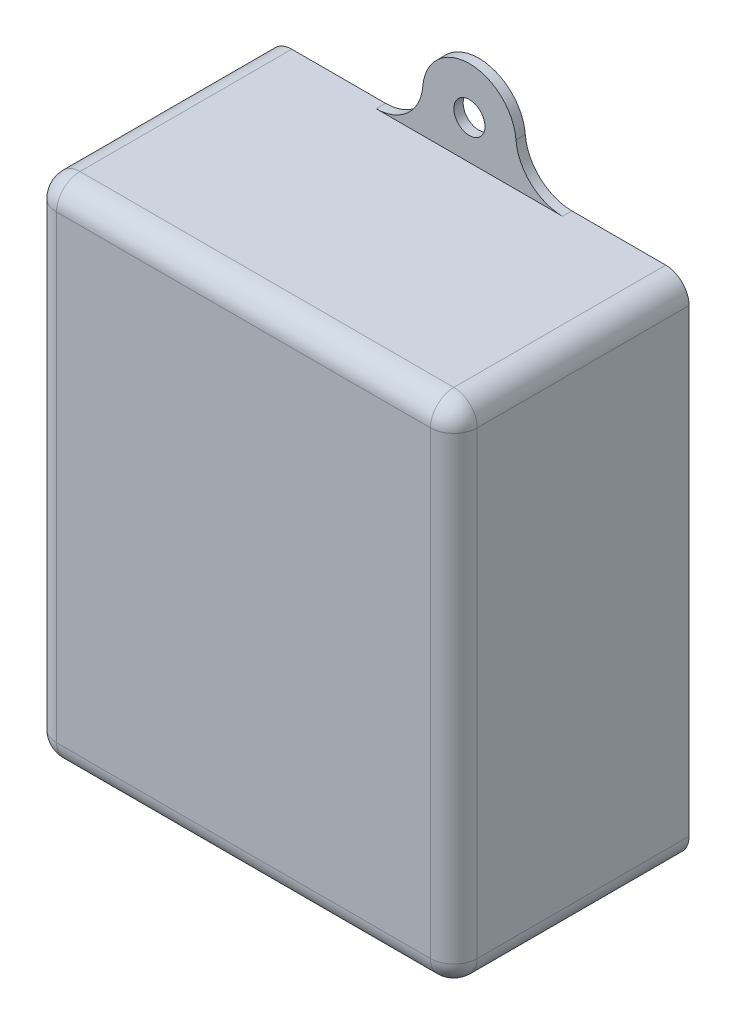
ISO-10303-21;
HEADER;
FILE_DESCRIPTION(('STEP AP214'),'2;1');
FILE_NAME('part.step','',(''),(''),'','','');
FILE_SCHEMA(('AUTOMOTIVE_DESIGN { 1 0 10303 214 1 1 1 1 }'));
ENDSEC;
DATA;
#1=APPLICATION_CONTEXT('core data for automotive mechanical design processes');
#2=APPLICATION_PROTOCOL_DEFINITION('international standard','automotive_design',2000,#1);
#3=PRODUCT_CONTEXT('',#1,'mechanical');
#4=PRODUCT('Part','Part','',(#3));
#5=PRODUCT_RELATED_PRODUCT_CATEGORY('part','',(#4));
#6=PRODUCT_DEFINITION_FORMATION('','',#4);
#7=PRODUCT_DEFINITION_CONTEXT('part definition',#1,'design');
#8=PRODUCT_DEFINITION('design','',#6,#7);
#9=PRODUCT_DEFINITION_SHAPE('','',#8);
#10=(LENGTH_UNIT() NAMED_UNIT(*) SI_UNIT(.MILLI.,.METRE.));
#11=(NAMED_UNIT(*) PLANE_ANGLE_UNIT() SI_UNIT($,.RADIAN.));
#12=(NAMED_UNIT(*) SI_UNIT($,.STERADIAN.) SOLID_ANGLE_UNIT());
#13=UNCERTAINTY_MEASURE_WITH_UNIT(LENGTH_MEASURE(1.E-05),#10,'distance_accuracy_value','');
#14=(GEOMETRIC_REPRESENTATION_CONTEXT(3) GLOBAL_UNCERTAINTY_ASSIGNED_CONTEXT((#13)) GLOBAL_UNIT_ASSIGNED_CONTEXT((#10,
#11,#12)) REPRESENTATION_CONTEXT('',''));
#15=CARTESIAN_POINT('',(0.,0.,0.));
#16=DIRECTION('',(0.,0.,1.));
#17=DIRECTION('',(1.,0.,0.));
#18=AXIS2_PLACEMENT_3D('',#15,#16,#17);
#19=CARTESIAN_POINT('',(-11.9582607431014,38.5,1.2));
#20=DIRECTION('',(0.,0.,-1.));
#21=DIRECTION('',(-1.,0.,0.));
#22=AXIS2_PLACEMENT_3D('',#19,#20,#21);
#23=PLANE('',#22);
#24=CARTESIAN_POINT('',(0.,37.5,1.2));
#25=DIRECTION('',(0.,0.,1.));
#26=DIRECTION('',(1.,0.,0.));
#27=AXIS2_PLACEMENT_3D('',#24,#25,#26);
#28=CIRCLE('',#27,2.);
#29=CARTESIAN_POINT('',(2.00000000000001,37.5,1.2));
#30=VERTEX_POINT('',#29);
#31=EDGE_CURVE('E180',#30,#30,#28,.T.);
#32=ORIENTED_EDGE('',*,*,#31,.F.);
#33=EDGE_LOOP('',(#32));
#34=FACE_BOUND('',#33,.T.);
#35=DIRECTION('',(-1.,0.,0.));
#36=VECTOR('',#35,1.);
#37=CARTESIAN_POINT('',(-27.,32.5,1.2));
#38=LINE('',#37,#36);
#39=CARTESIAN_POINT('',(11.9582607431014,32.5,1.2));
#40=VERTEX_POINT('',#39);
#41=CARTESIAN_POINT('',(-11.9582607431014,32.5,1.2));
#42=VERTEX_POINT('',#41);
#43=EDGE_CURVE('E171',#40,#42,#38,.T.);
#44=ORIENTED_EDGE('',*,*,#43,.F.);
#45=CARTESIAN_POINT('',(11.9582607431014,38.5,1.2));
#46=DIRECTION('',(0.,0.,-1.));
#47=DIRECTION('',(1.,0.,0.));
#48=AXIS2_PLACEMENT_3D('',#45,#46,#47);
#49=CIRCLE('',#48,5.99999999999999);
#50=CARTESIAN_POINT('',(5.97913037155071,38.,1.2));
#51=VERTEX_POINT('',#50);
#52=EDGE_CURVE('E215',#40,#51,#49,.T.);
#53=ORIENTED_EDGE('',*,*,#52,.T.);
#54=CARTESIAN_POINT('',(0.,37.5,1.2));
#55=DIRECTION('',(0.,0.,1.));
#56=DIRECTION('',(1.,0.,0.));
#57=AXIS2_PLACEMENT_3D('',#54,#55,#56);
#58=CIRCLE('',#57,6.00000000000001);
#59=CARTESIAN_POINT('',(-5.9791303715507,38.,1.2));
#60=VERTEX_POINT('',#59);
#61=EDGE_CURVE('E213',#51,#60,#58,.T.);
#62=ORIENTED_EDGE('',*,*,#61,.T.);
#63=CARTESIAN_POINT('',(-11.9582607431014,38.5,1.2));
#64=DIRECTION('',(0.,0.,-1.));
#65=DIRECTION('',(-1.,0.,0.));
#66=AXIS2_PLACEMENT_3D('',#63,#64,#65);
#67=CIRCLE('',#66,5.99999999999999);
#68=EDGE_CURVE('E208',#60,#42,#67,.T.);
#69=ORIENTED_EDGE('',*,*,#68,.T.);
#70=EDGE_LOOP('',(#44,#53,#62,#69));
#71=FACE_BOUND('',#70,.T.);
#72=ADVANCED_FACE('F29',(#34,#71),#23,.F.);
#73=CARTESIAN_POINT('',(0.,-37.5,1.2));
#74=DIRECTION('',(0.,0.,1.));
#75=DIRECTION('',(-1.,0.,0.));
#76=AXIS2_PLACEMENT_3D('',#73,#74,#75);
#77=CIRCLE('',#76,2.);
#78=CARTESIAN_POINT('',(-2.,-37.5,1.2));
#79=VERTEX_POINT('',#78);
#80=EDGE_CURVE('E343',#79,#79,#77,.T.);
#81=ORIENTED_EDGE('',*,*,#80,.F.);
#82=EDGE_LOOP('',(#81));
#83=FACE_BOUND('',#82,.T.);
#84=DIRECTION('',(1.,0.,0.));
#85=VECTOR('',#84,1.);
#86=CARTESIAN_POINT('',(-27.,-32.5,1.2));
#87=LINE('',#86,#85);
#88=CARTESIAN_POINT('',(-11.9582607431014,-32.5,1.2));
#89=VERTEX_POINT('',#88);
#90=CARTESIAN_POINT('',(11.9582607431014,-32.5,1.2));
#91=VERTEX_POINT('',#90);
#92=EDGE_CURVE('E174',#89,#91,#87,.T.);
#93=ORIENTED_EDGE('',*,*,#92,.F.);
#94=CARTESIAN_POINT('',(-11.9582607431014,-38.5,1.2));
#95=DIRECTION('',(0.,0.,-1.));
#96=DIRECTION('',(1.,0.,0.));
#97=AXIS2_PLACEMENT_3D('',#94,#95,#96);
#98=CIRCLE('',#97,5.99999999999999);
#99=CARTESIAN_POINT('',(-5.97913037155069,-38.,1.2));
#100=VERTEX_POINT('',#99);
#101=EDGE_CURVE('E212',#89,#100,#98,.T.);
#102=ORIENTED_EDGE('',*,*,#101,.T.);
#103=CARTESIAN_POINT('',(0.,-37.5,1.2));
#104=DIRECTION('',(0.,0.,1.));
#105=DIRECTION('',(-1.,0.,0.));
#106=AXIS2_PLACEMENT_3D('',#103,#104,#105);
#107=CIRCLE('',#106,6.);
#108=CARTESIAN_POINT('',(5.97913037155071,-38.,1.2));
#109=VERTEX_POINT('',#108);
#110=EDGE_CURVE('E209',#100,#109,#107,.T.);
#111=ORIENTED_EDGE('',*,*,#110,.T.);
#112=CARTESIAN_POINT('',(11.9582607431014,-38.5,1.2));
#113=DIRECTION('',(0.,0.,-1.));
#114=DIRECTION('',(-1.,0.,0.));
#115=AXIS2_PLACEMENT_3D('',#112,#113,#114);
#116=CIRCLE('',#115,5.99999999999999);
#117=EDGE_CURVE('E211',#109,#91,#116,.T.);
#118=ORIENTED_EDGE('',*,*,#117,.T.);
#119=EDGE_LOOP('',(#93,#102,#111,#118));
#120=FACE_BOUND('',#119,.T.);
#121=ADVANCED_FACE('F367',(#83,#120),#23,.F.);
#122=CARTESIAN_POINT('',(-11.9582607431014,38.5,0.));
#123=DIRECTION('',(0.,0.,-1.));
#124=DIRECTION('',(-1.,0.,0.));
#125=AXIS2_PLACEMENT_3D('',#122,#123,#124);
#126=PLANE('',#125);
#127=CARTESIAN_POINT('',(0.,37.5,0.));
#128=DIRECTION('',(0.,0.,1.));
#129=DIRECTION('',(1.,0.,0.));
#130=AXIS2_PLACEMENT_3D('',#127,#128,#129);
#131=CIRCLE('',#130,2.);
#132=CARTESIAN_POINT('',(2.00000000000001,37.5,0.));
#133=VERTEX_POINT('',#132);
#134=EDGE_CURVE('E183',#133,#133,#131,.T.);
#135=ORIENTED_EDGE('',*,*,#134,.T.);
#136=EDGE_LOOP('',(#135));
#137=FACE_BOUND('',#136,.T.);
#138=DIRECTION('',(0.,-1.,0.));
#139=VECTOR('',#138,1.);
#140=CARTESIAN_POINT('',(-27.,32.5,0.));
#141=LINE('',#140,#139);
#142=CARTESIAN_POINT('',(-27.,29.5,0.));
#143=VERTEX_POINT('',#142);
#144=CARTESIAN_POINT('',(-27.,-29.5,0.));
#145=VERTEX_POINT('',#144);
#146=EDGE_CURVE('E164',#143,#145,#141,.T.);
#147=ORIENTED_EDGE('',*,*,#146,.F.);
#148=CARTESIAN_POINT('',(-24.,29.5,0.));
#149=DIRECTION('',(0.,0.,-1.));
#150=DIRECTION('',(-1.,0.,0.));
#151=AXIS2_PLACEMENT_3D('',#148,#149,#150);
#152=CIRCLE('',#151,3.);
#153=CARTESIAN_POINT('',(-24.,32.5,0.));
#154=VERTEX_POINT('',#153);
#155=EDGE_CURVE('E11',#143,#154,#152,.T.);
#156=ORIENTED_EDGE('',*,*,#155,.T.);
#157=DIRECTION('',(-1.,0.,0.));
#158=VECTOR('',#157,1.);
#159=CARTESIAN_POINT('',(-11.9582607431014,32.5,0.));
#160=LINE('',#159,#158);
#161=CARTESIAN_POINT('',(-11.9582607431014,32.5,0.));
#162=VERTEX_POINT('',#161);
#163=EDGE_CURVE('E153',#162,#154,#160,.T.);
#164=ORIENTED_EDGE('',*,*,#163,.F.);
#165=CARTESIAN_POINT('',(-11.9582607431014,38.5,0.));
#166=DIRECTION('',(0.,0.,-1.));
#167=DIRECTION('',(-1.,0.,0.));
#168=AXIS2_PLACEMENT_3D('',#165,#166,#167);
#169=CIRCLE('',#168,5.99999999999999);
#170=CARTESIAN_POINT('',(-5.9791303715507,38.,0.));
#171=VERTEX_POINT('',#170);
#172=EDGE_CURVE('E160',#171,#162,#169,.T.);
#173=ORIENTED_EDGE('',*,*,#172,.F.);
#174=CARTESIAN_POINT('',(0.,37.5,0.));
#175=DIRECTION('',(0.,0.,1.));
#176=DIRECTION('',(1.,0.,0.));
#177=AXIS2_PLACEMENT_3D('',#174,#175,#176);
#178=CIRCLE('',#177,6.00000000000001);
#179=CARTESIAN_POINT('',(5.97913037155071,38.,0.));
#180=VERTEX_POINT('',#179);
#181=EDGE_CURVE('E206',#180,#171,#178,.T.);
#182=ORIENTED_EDGE('',*,*,#181,.F.);
#183=CARTESIAN_POINT('',(11.9582607431014,38.5,0.));
#184=DIRECTION('',(0.,0.,-1.));
#185=DIRECTION('',(1.,0.,0.));
#186=AXIS2_PLACEMENT_3D('',#183,#184,#185);
#187=CIRCLE('',#186,5.99999999999999);
#188=CARTESIAN_POINT('',(11.9582607431014,32.5,0.));
#189=VERTEX_POINT('',#188);
#190=EDGE_CURVE('E204',#189,#180,#187,.T.);
#191=ORIENTED_EDGE('',*,*,#190,.F.);
#192=DIRECTION('',(-1.,0.,0.));
#193=VECTOR('',#192,1.);
#194=CARTESIAN_POINT('',(11.9582607431014,32.5,0.));
#195=LINE('',#194,#193);
#196=CARTESIAN_POINT('',(24.,32.5,0.));
#197=VERTEX_POINT('',#196);
#198=EDGE_CURVE('E202',#197,#189,#195,.T.);
#199=ORIENTED_EDGE('',*,*,#198,.F.);
#200=CARTESIAN_POINT('',(24.,29.5,0.));
#201=DIRECTION('',(0.,0.,-1.));
#202=DIRECTION('',(-1.,0.,0.));
#203=AXIS2_PLACEMENT_3D('',#200,#201,#202);
#204=CIRCLE('',#203,3.);
#205=CARTESIAN_POINT('',(27.,29.5,0.));
#206=VERTEX_POINT('',#205);
#207=EDGE_CURVE('E281',#197,#206,#204,.T.);
#208=ORIENTED_EDGE('',*,*,#207,.T.);
#209=DIRECTION('',(0.,1.,0.));
#210=VECTOR('',#209,1.);
#211=CARTESIAN_POINT('',(27.,-32.5,0.));
#212=LINE('',#211,#210);
#213=CARTESIAN_POINT('',(27.,-29.5,0.));
#214=VERTEX_POINT('',#213);
#215=EDGE_CURVE('E199',#214,#206,#212,.T.);
#216=ORIENTED_EDGE('',*,*,#215,.F.);
#217=CARTESIAN_POINT('',(24.,-29.5,0.));
#218=DIRECTION('',(0.,0.,-1.));
#219=DIRECTION('',(-1.,0.,0.));
#220=AXIS2_PLACEMENT_3D('',#217,#218,#219);
#221=CIRCLE('',#220,3.);
#222=CARTESIAN_POINT('',(24.,-32.5,0.));
#223=VERTEX_POINT('',#222);
#224=EDGE_CURVE('E283',#214,#223,#221,.T.);
#225=ORIENTED_EDGE('',*,*,#224,.T.);
#226=DIRECTION('',(1.,0.,0.));
#227=VECTOR('',#226,1.);
#228=CARTESIAN_POINT('',(11.9582607431014,-32.5,0.));
#229=LINE('',#228,#227);
#230=CARTESIAN_POINT('',(11.9582607431014,-32.5,0.));
#231=VERTEX_POINT('',#230);
#232=EDGE_CURVE('E196',#231,#223,#229,.T.);
#233=ORIENTED_EDGE('',*,*,#232,.F.);
#234=CARTESIAN_POINT('',(11.9582607431014,-38.5,0.));
#235=DIRECTION('',(0.,0.,-1.));
#236=DIRECTION('',(-1.,0.,0.));
#237=AXIS2_PLACEMENT_3D('',#234,#235,#236);
#238=CIRCLE('',#237,5.99999999999999);
#239=CARTESIAN_POINT('',(5.97913037155071,-38.,0.));
#240=VERTEX_POINT('',#239);
#241=EDGE_CURVE('E194',#240,#231,#238,.T.);
#242=ORIENTED_EDGE('',*,*,#241,.F.);
#243=CARTESIAN_POINT('',(0.,-37.5,0.));
#244=DIRECTION('',(0.,0.,1.));
#245=DIRECTION('',(-1.,0.,0.));
#246=AXIS2_PLACEMENT_3D('',#243,#244,#245);
#247=CIRCLE('',#246,6.);
#248=CARTESIAN_POINT('',(-5.97913037155069,-38.,0.));
#249=VERTEX_POINT('',#248);
#250=EDGE_CURVE('E192',#249,#240,#247,.T.);
#251=ORIENTED_EDGE('',*,*,#250,.F.);
#252=CARTESIAN_POINT('',(-11.9582607431014,-38.5,0.));
#253=DIRECTION('',(0.,0.,-1.));
#254=DIRECTION('',(1.,0.,0.));
#255=AXIS2_PLACEMENT_3D('',#252,#253,#254);
#256=CIRCLE('',#255,5.99999999999999);
#257=CARTESIAN_POINT('',(-11.9582607431014,-32.5,0.));
#258=VERTEX_POINT('',#257);
#259=EDGE_CURVE('E190',#258,#249,#256,.T.);
#260=ORIENTED_EDGE('',*,*,#259,.F.);
#261=DIRECTION('',(1.,0.,0.));
#262=VECTOR('',#261,1.);
#263=CARTESIAN_POINT('',(-11.9582607431014,-32.5,0.));
#264=LINE('',#263,#262);
#265=CARTESIAN_POINT('',(-24.,-32.5,0.));
#266=VERTEX_POINT('',#265);
#267=EDGE_CURVE('E188',#266,#258,#264,.T.);
#268=ORIENTED_EDGE('',*,*,#267,.F.);
#269=CARTESIAN_POINT('',(-24.,-29.5,0.));
#270=DIRECTION('',(0.,0.,-1.));
#271=DIRECTION('',(-1.,0.,0.));
#272=AXIS2_PLACEMENT_3D('',#269,#270,#271);
#273=CIRCLE('',#272,3.);
#274=EDGE_CURVE('E37',#266,#145,#273,.T.);
#275=ORIENTED_EDGE('',*,*,#274,.T.);
#276=EDGE_LOOP('',(#147,#156,#164,#173,#182,#191,#199,#208,#216,#225,#233,#242,#251,#260,#268,#275));
#277=FACE_BOUND('',#276,.T.);
#278=CARTESIAN_POINT('',(0.,-37.5,0.));
#279=DIRECTION('',(0.,0.,1.));
#280=DIRECTION('',(-1.,0.,0.));
#281=AXIS2_PLACEMENT_3D('',#278,#279,#280);
#282=CIRCLE('',#281,2.);
#283=CARTESIAN_POINT('',(-2.,-37.5,0.));
#284=VERTEX_POINT('',#283);
#285=EDGE_CURVE('E340',#284,#284,#282,.T.);
#286=ORIENTED_EDGE('',*,*,#285,.T.);
#287=EDGE_LOOP('',(#286));
#288=FACE_BOUND('',#287,.T.);
#289=ADVANCED_FACE('F156',(#137,#277,#288),#126,.T.);
#290=CARTESIAN_POINT('',(-11.9582607431014,38.5,1.2));
#291=DIRECTION('',(0.,0.,-1.));
#292=DIRECTION('',(-1.,0.,0.));
#293=AXIS2_PLACEMENT_3D('',#290,#291,#292);
#294=CYLINDRICAL_SURFACE('',#293,5.99999999999999);
#295=ORIENTED_EDGE('',*,*,#172,.T.);
#296=DIRECTION('',(0.,0.,-1.));
#297=VECTOR('',#296,1.);
#298=CARTESIAN_POINT('',(-11.9582607431014,32.5,1.2));
#299=LINE('',#298,#297);
#300=EDGE_CURVE('E168',#42,#162,#299,.T.);
#301=ORIENTED_EDGE('',*,*,#300,.F.);
#302=ORIENTED_EDGE('',*,*,#68,.F.);
#303=DIRECTION('',(0.,0.,-1.));
#304=VECTOR('',#303,1.);
#305=CARTESIAN_POINT('',(-5.9791303715507,38.,1.2));
#306=LINE('',#305,#304);
#307=EDGE_CURVE('E179',#60,#171,#306,.T.);
#308=ORIENTED_EDGE('',*,*,#307,.T.);
#309=EDGE_LOOP('',(#295,#301,#302,#308));
#310=FACE_BOUND('',#309,.T.);
#311=ADVANCED_FACE('F31',(#310),#294,.F.);
#312=CARTESIAN_POINT('',(-27.,32.5,1.2));
#313=DIRECTION('',(1.,0.,0.));
#314=DIRECTION('',(0.,1.,0.));
#315=AXIS2_PLACEMENT_3D('',#312,#313,#314);
#316=PLANE('',#315);
#317=DIRECTION('',(0.,-1.,0.));
#318=VECTOR('',#317,1.);
#319=CARTESIAN_POINT('',(-27.,32.5,27.2));
#320=LINE('',#319,#318);
#321=CARTESIAN_POINT('',(-27.,-29.5,27.2));
#322=VERTEX_POINT('',#321);
#323=CARTESIAN_POINT('',(-27.,29.5,27.2));
#324=VERTEX_POINT('',#323);
#325=EDGE_CURVE('E44',#322,#324,#320,.F.);
#326=ORIENTED_EDGE('',*,*,#325,.T.);
#327=DIRECTION('',(0.,0.,-1.));
#328=VECTOR('',#327,1.);
#329=CARTESIAN_POINT('',(-27.,29.5,1.2));
#330=LINE('',#329,#328);
#331=EDGE_CURVE('E279',#324,#143,#330,.T.);
#332=ORIENTED_EDGE('',*,*,#331,.T.);
#333=ORIENTED_EDGE('',*,*,#146,.T.);
#334=DIRECTION('',(0.,0.,-1.));
#335=VECTOR('',#334,1.);
#336=CARTESIAN_POINT('',(-27.,-29.5,1.2));
#337=LINE('',#336,#335);
#338=EDGE_CURVE('E49',#145,#322,#337,.F.);
#339=ORIENTED_EDGE('',*,*,#338,.T.);
#340=EDGE_LOOP('',(#326,#332,#333,#339));
#341=FACE_BOUND('',#340,.T.);
#342=ADVANCED_FACE('F289',(#341),#316,.F.);
#343=CARTESIAN_POINT('',(-11.9582607431014,-38.5,1.2));
#344=DIRECTION('',(0.,0.,-1.));
#345=DIRECTION('',(-1.,0.,0.));
#346=AXIS2_PLACEMENT_3D('',#343,#344,#345);
#347=CYLINDRICAL_SURFACE('',#346,5.99999999999999);
#348=ORIENTED_EDGE('',*,*,#259,.T.);
#349=DIRECTION('',(0.,0.,-1.));
#350=VECTOR('',#349,1.);
#351=CARTESIAN_POINT('',(-5.97913037155069,-38.,1.2));
#352=LINE('',#351,#350);
#353=EDGE_CURVE('E224',#100,#249,#352,.T.);
#354=ORIENTED_EDGE('',*,*,#353,.F.);
#355=ORIENTED_EDGE('',*,*,#101,.F.);
#356=DIRECTION('',(0.,0.,-1.));
#357=VECTOR('',#356,1.);
#358=CARTESIAN_POINT('',(-11.9582607431014,-32.5,1.2));
#359=LINE('',#358,#357);
#360=EDGE_CURVE('E175',#89,#258,#359,.T.);
#361=ORIENTED_EDGE('',*,*,#360,.T.);
#362=EDGE_LOOP('',(#348,#354,#355,#361));
#363=FACE_BOUND('',#362,.T.);
#364=ADVANCED_FACE('F397',(#363),#347,.F.);
#365=CARTESIAN_POINT('',(0.,-37.5,1.2));
#366=DIRECTION('',(0.,0.,-1.));
#367=DIRECTION('',(-1.,0.,0.));
#368=AXIS2_PLACEMENT_3D('',#365,#366,#367);
#369=CYLINDRICAL_SURFACE('',#368,6.);
#370=ORIENTED_EDGE('',*,*,#250,.T.);
#371=DIRECTION('',(0.,0.,-1.));
#372=VECTOR('',#371,1.);
#373=CARTESIAN_POINT('',(5.97913037155071,-38.,1.2));
#374=LINE('',#373,#372);
#375=EDGE_CURVE('E221',#109,#240,#374,.T.);
#376=ORIENTED_EDGE('',*,*,#375,.F.);
#377=ORIENTED_EDGE('',*,*,#110,.F.);
#378=ORIENTED_EDGE('',*,*,#353,.T.);
#379=EDGE_LOOP('',(#370,#376,#377,#378));
#380=FACE_BOUND('',#379,.T.);
#381=ADVANCED_FACE('F393',(#380),#369,.T.);
#382=CARTESIAN_POINT('',(11.9582607431014,-38.5,1.2));
#383=DIRECTION('',(0.,0.,-1.));
#384=DIRECTION('',(-1.,0.,0.));
#385=AXIS2_PLACEMENT_3D('',#382,#383,#384);
#386=CYLINDRICAL_SURFACE('',#385,5.99999999999999);
#387=ORIENTED_EDGE('',*,*,#241,.T.);
#388=DIRECTION('',(0.,0.,-1.));
#389=VECTOR('',#388,1.);
#390=CARTESIAN_POINT('',(11.9582607431014,-32.5,1.2));
#391=LINE('',#390,#389);
#392=EDGE_CURVE('E225',#91,#231,#391,.T.);
#393=ORIENTED_EDGE('',*,*,#392,.F.);
#394=ORIENTED_EDGE('',*,*,#117,.F.);
#395=ORIENTED_EDGE('',*,*,#375,.T.);
#396=EDGE_LOOP('',(#387,#393,#394,#395));
#397=FACE_BOUND('',#396,.T.);
#398=ADVANCED_FACE('F389',(#397),#386,.F.);
#399=CARTESIAN_POINT('',(11.9582607431014,-32.5,1.2));
#400=DIRECTION('',(0.,1.,0.));
#401=DIRECTION('',(0.,0.,1.));
#402=AXIS2_PLACEMENT_3D('',#399,#400,#401);
#403=PLANE('',#402);
#404=DIRECTION('',(1.,0.,0.));
#405=VECTOR('',#404,1.);
#406=CARTESIAN_POINT('',(-27.,-32.5,27.2));
#407=LINE('',#406,#405);
#408=CARTESIAN_POINT('',(24.,-32.5,27.2));
#409=VERTEX_POINT('',#408);
#410=CARTESIAN_POINT('',(-24.,-32.5,27.2));
#411=VERTEX_POINT('',#410);
#412=EDGE_CURVE('E273',#409,#411,#407,.F.);
#413=ORIENTED_EDGE('',*,*,#412,.T.);
#414=DIRECTION('',(0.,0.,-1.));
#415=VECTOR('',#414,1.);
#416=CARTESIAN_POINT('',(-24.,-32.5,1.2));
#417=LINE('',#416,#415);
#418=EDGE_CURVE('E275',#411,#266,#417,.T.);
#419=ORIENTED_EDGE('',*,*,#418,.T.);
#420=ORIENTED_EDGE('',*,*,#267,.T.);
#421=ORIENTED_EDGE('',*,*,#360,.F.);
#422=ORIENTED_EDGE('',*,*,#92,.T.);
#423=ORIENTED_EDGE('',*,*,#392,.T.);
#424=ORIENTED_EDGE('',*,*,#232,.T.);
#425=DIRECTION('',(0.,0.,-1.));
#426=VECTOR('',#425,1.);
#427=CARTESIAN_POINT('',(24.,-32.5,1.2));
#428=LINE('',#427,#426);
#429=EDGE_CURVE('E271',#223,#409,#428,.F.);
#430=ORIENTED_EDGE('',*,*,#429,.T.);
#431=EDGE_LOOP('',(#413,#419,#420,#421,#422,#423,#424,#430));
#432=FACE_BOUND('',#431,.T.);
#433=ADVANCED_FACE('F385',(#432),#403,.F.);
#434=CARTESIAN_POINT('',(27.,-32.5,1.2));
#435=DIRECTION('',(-1.,0.,0.));
#436=DIRECTION('',(0.,0.,1.));
#437=AXIS2_PLACEMENT_3D('',#434,#435,#436);
#438=PLANE('',#437);
#439=DIRECTION('',(0.,1.,0.));
#440=VECTOR('',#439,1.);
#441=CARTESIAN_POINT('',(27.,-32.5,27.2));
#442=LINE('',#441,#440);
#443=CARTESIAN_POINT('',(27.,29.5,27.2));
#444=VERTEX_POINT('',#443);
#445=CARTESIAN_POINT('',(27.,-29.5,27.2));
#446=VERTEX_POINT('',#445);
#447=EDGE_CURVE('E267',#444,#446,#442,.F.);
#448=ORIENTED_EDGE('',*,*,#447,.T.);
#449=DIRECTION('',(0.,0.,-1.));
#450=VECTOR('',#449,1.);
#451=CARTESIAN_POINT('',(27.,-29.5,1.2));
#452=LINE('',#451,#450);
#453=EDGE_CURVE('E269',#446,#214,#452,.T.);
#454=ORIENTED_EDGE('',*,*,#453,.T.);
#455=ORIENTED_EDGE('',*,*,#215,.T.);
#456=DIRECTION('',(0.,0.,-1.));
#457=VECTOR('',#456,1.);
#458=CARTESIAN_POINT('',(27.,29.5,1.2));
#459=LINE('',#458,#457);
#460=EDGE_CURVE('E265',#206,#444,#459,.F.);
#461=ORIENTED_EDGE('',*,*,#460,.T.);
#462=EDGE_LOOP('',(#448,#454,#455,#461));
#463=FACE_BOUND('',#462,.T.);
#464=ADVANCED_FACE('F382',(#463),#438,.F.);
#465=CARTESIAN_POINT('',(11.9582607431014,32.5,1.2));
#466=DIRECTION('',(0.,-1.,0.));
#467=DIRECTION('',(0.,0.,-1.));
#468=AXIS2_PLACEMENT_3D('',#465,#466,#467);
#469=PLANE('',#468);
#470=ORIENTED_EDGE('',*,*,#163,.T.);
#471=DIRECTION('',(0.,0.,-1.));
#472=VECTOR('',#471,1.);
#473=CARTESIAN_POINT('',(-24.,32.5,1.2));
#474=LINE('',#473,#472);
#475=CARTESIAN_POINT('',(-24.,32.5,27.2));
#476=VERTEX_POINT('',#475);
#477=EDGE_CURVE('E263',#154,#476,#474,.F.);
#478=ORIENTED_EDGE('',*,*,#477,.T.);
#479=DIRECTION('',(-1.,0.,0.));
#480=VECTOR('',#479,1.);
#481=CARTESIAN_POINT('',(27.,32.5,27.2));
#482=LINE('',#481,#480);
#483=CARTESIAN_POINT('',(24.,32.5,27.2));
#484=VERTEX_POINT('',#483);
#485=EDGE_CURVE('E260',#476,#484,#482,.F.);
#486=ORIENTED_EDGE('',*,*,#485,.T.);
#487=DIRECTION('',(0.,0.,-1.));
#488=VECTOR('',#487,1.);
#489=CARTESIAN_POINT('',(24.,32.5,1.2));
#490=LINE('',#489,#488);
#491=EDGE_CURVE('E258',#484,#197,#490,.T.);
#492=ORIENTED_EDGE('',*,*,#491,.T.);
#493=ORIENTED_EDGE('',*,*,#198,.T.);
#494=DIRECTION('',(0.,0.,-1.));
#495=VECTOR('',#494,1.);
#496=CARTESIAN_POINT('',(11.9582607431014,32.5,1.2));
#497=LINE('',#496,#495);
#498=EDGE_CURVE('E220',#40,#189,#497,.T.);
#499=ORIENTED_EDGE('',*,*,#498,.F.);
#500=ORIENTED_EDGE('',*,*,#43,.T.);
#501=ORIENTED_EDGE('',*,*,#300,.T.);
#502=EDGE_LOOP('',(#470,#478,#486,#492,#493,#499,#500,#501));
#503=FACE_BOUND('',#502,.T.);
#504=ADVANCED_FACE('F169',(#503),#469,.F.);
#505=CARTESIAN_POINT('',(11.9582607431014,38.5,1.2));
#506=DIRECTION('',(0.,0.,-1.));
#507=DIRECTION('',(-1.,0.,0.));
#508=AXIS2_PLACEMENT_3D('',#505,#506,#507);
#509=CYLINDRICAL_SURFACE('',#508,5.99999999999999);
#510=ORIENTED_EDGE('',*,*,#190,.T.);
#511=DIRECTION('',(0.,0.,-1.));
#512=VECTOR('',#511,1.);
#513=CARTESIAN_POINT('',(5.97913037155071,38.,1.2));
#514=LINE('',#513,#512);
#515=EDGE_CURVE('E217',#51,#180,#514,.T.);
#516=ORIENTED_EDGE('',*,*,#515,.F.);
#517=ORIENTED_EDGE('',*,*,#52,.F.);
#518=ORIENTED_EDGE('',*,*,#498,.T.);
#519=EDGE_LOOP('',(#510,#516,#517,#518));
#520=FACE_BOUND('',#519,.T.);
#521=ADVANCED_FACE('F362',(#520),#509,.F.);
#522=CARTESIAN_POINT('',(0.,37.5,1.2));
#523=DIRECTION('',(0.,0.,-1.));
#524=DIRECTION('',(-1.,0.,0.));
#525=AXIS2_PLACEMENT_3D('',#522,#523,#524);
#526=CYLINDRICAL_SURFACE('',#525,6.00000000000001);
#527=ORIENTED_EDGE('',*,*,#181,.T.);
#528=ORIENTED_EDGE('',*,*,#307,.F.);
#529=ORIENTED_EDGE('',*,*,#61,.F.);
#530=ORIENTED_EDGE('',*,*,#515,.T.);
#531=EDGE_LOOP('',(#527,#528,#529,#530));
#532=FACE_BOUND('',#531,.T.);
#533=ADVANCED_FACE('F352',(#532),#526,.T.);
#534=CARTESIAN_POINT('',(0.,37.5,1.2));
#535=DIRECTION('',(0.,0.,-1.));
#536=DIRECTION('',(-1.,0.,0.));
#537=AXIS2_PLACEMENT_3D('',#534,#535,#536);
#538=CYLINDRICAL_SURFACE('',#537,2.);
#539=ORIENTED_EDGE('',*,*,#31,.T.);
#540=EDGE_LOOP('',(#539));
#541=FACE_BOUND('',#540,.T.);
#542=ORIENTED_EDGE('',*,*,#134,.F.);
#543=EDGE_LOOP('',(#542));
#544=FACE_BOUND('',#543,.T.);
#545=ADVANCED_FACE('F349',(#541,#544),#538,.F.);
#546=CARTESIAN_POINT('',(0.,-37.5,1.2));
#547=DIRECTION('',(0.,0.,-1.));
#548=DIRECTION('',(-1.,0.,0.));
#549=AXIS2_PLACEMENT_3D('',#546,#547,#548);
#550=CYLINDRICAL_SURFACE('',#549,2.);
#551=ORIENTED_EDGE('',*,*,#80,.T.);
#552=EDGE_LOOP('',(#551));
#553=FACE_BOUND('',#552,.T.);
#554=ORIENTED_EDGE('',*,*,#285,.F.);
#555=EDGE_LOOP('',(#554));
#556=FACE_BOUND('',#555,.T.);
#557=ADVANCED_FACE('F351',(#553,#556),#550,.F.);
#558=CARTESIAN_POINT('',(-27.,-32.5,30.2));
#559=DIRECTION('',(0.,0.,1.));
#560=DIRECTION('',(1.,0.,0.));
#561=AXIS2_PLACEMENT_3D('',#558,#559,#560);
#562=PLANE('',#561);
#563=DIRECTION('',(0.,1.,0.));
#564=VECTOR('',#563,1.);
#565=CARTESIAN_POINT('',(24.,32.5,30.2));
#566=LINE('',#565,#564);
#567=CARTESIAN_POINT('',(24.,-29.5,30.2));
#568=VERTEX_POINT('',#567);
#569=CARTESIAN_POINT('',(24.,29.5,30.2));
#570=VERTEX_POINT('',#569);
#571=EDGE_CURVE('E253',#568,#570,#566,.T.);
#572=ORIENTED_EDGE('',*,*,#571,.T.);
#573=DIRECTION('',(-1.,0.,0.));
#574=VECTOR('',#573,1.);
#575=CARTESIAN_POINT('',(-27.,29.5,30.2));
#576=LINE('',#575,#574);
#577=CARTESIAN_POINT('',(-24.,29.5,30.2));
#578=VERTEX_POINT('',#577);
#579=EDGE_CURVE('E255',#570,#578,#576,.T.);
#580=ORIENTED_EDGE('',*,*,#579,.T.);
#581=DIRECTION('',(0.,-1.,0.));
#582=VECTOR('',#581,1.);
#583=CARTESIAN_POINT('',(-24.,-32.5,30.2));
#584=LINE('',#583,#582);
#585=CARTESIAN_POINT('',(-24.,-29.5,30.2));
#586=VERTEX_POINT('',#585);
#587=EDGE_CURVE('E235',#578,#586,#584,.T.);
#588=ORIENTED_EDGE('',*,*,#587,.T.);
#589=DIRECTION('',(1.,0.,0.));
#590=VECTOR('',#589,1.);
#591=CARTESIAN_POINT('',(27.,-29.5,30.2));
#592=LINE('',#591,#590);
#593=EDGE_CURVE('E251',#586,#568,#592,.T.);
#594=ORIENTED_EDGE('',*,*,#593,.T.);
#595=EDGE_LOOP('',(#572,#580,#588,#594));
#596=FACE_BOUND('',#595,.T.);
#597=ADVANCED_FACE('F359',(#596),#562,.T.);
#598=CARTESIAN_POINT('',(24.,-29.5,1.2));
#599=DIRECTION('',(0.,0.,-1.));
#600=DIRECTION('',(-1.,0.,0.));
#601=AXIS2_PLACEMENT_3D('',#598,#599,#600);
#602=CYLINDRICAL_SURFACE('',#601,3.);
#603=ORIENTED_EDGE('',*,*,#224,.F.);
#604=ORIENTED_EDGE('',*,*,#453,.F.);
#605=CARTESIAN_POINT('',(24.,-29.5,27.2));
#606=DIRECTION('',(0.,0.,1.));
#607=DIRECTION('',(1.,0.,0.));
#608=AXIS2_PLACEMENT_3D('',#605,#606,#607);
#609=CIRCLE('',#608,3.);
#610=EDGE_CURVE('E337',#409,#446,#609,.T.);
#611=ORIENTED_EDGE('',*,*,#610,.F.);
#612=ORIENTED_EDGE('',*,*,#429,.F.);
#613=EDGE_LOOP('',(#603,#604,#611,#612));
#614=FACE_BOUND('',#613,.T.);
#615=ADVANCED_FACE('F477',(#614),#602,.T.);
#616=CARTESIAN_POINT('',(-27.,-29.5,27.2));
#617=DIRECTION('',(-1.,0.,0.));
#618=DIRECTION('',(0.,0.,1.));
#619=AXIS2_PLACEMENT_3D('',#616,#617,#618);
#620=CYLINDRICAL_SURFACE('',#619,3.);
#621=CARTESIAN_POINT('',(-24.,-29.5,27.2));
#622=DIRECTION('',(-1.,0.,0.));
#623=DIRECTION('',(0.,0.,1.));
#624=AXIS2_PLACEMENT_3D('',#621,#622,#623);
#625=CIRCLE('',#624,3.);
#626=EDGE_CURVE('E297',#411,#586,#625,.T.);
#627=ORIENTED_EDGE('',*,*,#626,.F.);
#628=ORIENTED_EDGE('',*,*,#412,.F.);
#629=CARTESIAN_POINT('',(24.,-29.5,27.2));
#630=DIRECTION('',(1.,0.,0.));
#631=DIRECTION('',(0.,1.,0.));
#632=AXIS2_PLACEMENT_3D('',#629,#630,#631);
#633=CIRCLE('',#632,3.);
#634=EDGE_CURVE('E334',#568,#409,#633,.T.);
#635=ORIENTED_EDGE('',*,*,#634,.F.);
#636=ORIENTED_EDGE('',*,*,#593,.F.);
#637=EDGE_LOOP('',(#627,#628,#635,#636));
#638=FACE_BOUND('',#637,.T.);
#639=ADVANCED_FACE('F485',(#638),#620,.T.);
#640=CARTESIAN_POINT('',(-24.,-29.5,1.2));
#641=DIRECTION('',(0.,0.,-1.));
#642=DIRECTION('',(-1.,0.,0.));
#643=AXIS2_PLACEMENT_3D('',#640,#641,#642);
#644=CYLINDRICAL_SURFACE('',#643,3.);
#645=ORIENTED_EDGE('',*,*,#274,.F.);
#646=ORIENTED_EDGE('',*,*,#418,.F.);
#647=CARTESIAN_POINT('',(-24.,-29.5,27.2));
#648=DIRECTION('',(0.,0.,1.));
#649=DIRECTION('',(1.,0.,0.));
#650=AXIS2_PLACEMENT_3D('',#647,#648,#649);
#651=CIRCLE('',#650,3.);
#652=EDGE_CURVE('E292',#322,#411,#651,.T.);
#653=ORIENTED_EDGE('',*,*,#652,.F.);
#654=ORIENTED_EDGE('',*,*,#338,.F.);
#655=EDGE_LOOP('',(#645,#646,#653,#654));
#656=FACE_BOUND('',#655,.T.);
#657=ADVANCED_FACE('F290',(#656),#644,.T.);
#658=CARTESIAN_POINT('',(24.,-29.5,27.2));
#659=DIRECTION('',(0.,0.,1.));
#660=DIRECTION('',(1.,0.,0.));
#661=AXIS2_PLACEMENT_3D('',#658,#659,#660);
#662=SPHERICAL_SURFACE('',#661,3.);
#663=ORIENTED_EDGE('',*,*,#634,.T.);
#664=ORIENTED_EDGE('',*,*,#610,.T.);
#665=CARTESIAN_POINT('',(24.,-29.5,27.2));
#666=DIRECTION('',(0.,-1.,0.));
#667=DIRECTION('',(0.,0.,-1.));
#668=AXIS2_PLACEMENT_3D('',#665,#666,#667);
#669=CIRCLE('',#668,3.);
#670=EDGE_CURVE('E298',#568,#446,#669,.F.);
#671=ORIENTED_EDGE('',*,*,#670,.F.);
#672=EDGE_LOOP('',(#663,#664,#671));
#673=FACE_BOUND('',#672,.T.);
#674=ADVANCED_FACE('F500',(#673),#662,.T.);
#675=CARTESIAN_POINT('',(-24.,-29.5,27.2));
#676=DIRECTION('',(0.,0.,1.));
#677=DIRECTION('',(1.,0.,0.));
#678=AXIS2_PLACEMENT_3D('',#675,#676,#677);
#679=SPHERICAL_SURFACE('',#678,3.);
#680=ORIENTED_EDGE('',*,*,#652,.T.);
#681=ORIENTED_EDGE('',*,*,#626,.T.);
#682=CARTESIAN_POINT('',(-24.,-29.5,27.2));
#683=DIRECTION('',(0.,-1.,0.));
#684=DIRECTION('',(0.,0.,-1.));
#685=AXIS2_PLACEMENT_3D('',#682,#683,#684);
#686=CIRCLE('',#685,3.);
#687=EDGE_CURVE('E301',#322,#586,#686,.F.);
#688=ORIENTED_EDGE('',*,*,#687,.F.);
#689=EDGE_LOOP('',(#680,#681,#688));
#690=FACE_BOUND('',#689,.T.);
#691=ADVANCED_FACE('F302',(#690),#679,.T.);
#692=CARTESIAN_POINT('',(24.,29.5,1.2));
#693=DIRECTION('',(0.,0.,-1.));
#694=DIRECTION('',(-1.,0.,0.));
#695=AXIS2_PLACEMENT_3D('',#692,#693,#694);
#696=CYLINDRICAL_SURFACE('',#695,3.);
#697=ORIENTED_EDGE('',*,*,#207,.F.);
#698=ORIENTED_EDGE('',*,*,#491,.F.);
#699=CARTESIAN_POINT('',(24.,29.5,27.2));
#700=DIRECTION('',(0.,0.,1.));
#701=DIRECTION('',(1.,0.,0.));
#702=AXIS2_PLACEMENT_3D('',#699,#700,#701);
#703=CIRCLE('',#702,3.);
#704=EDGE_CURVE('E305',#444,#484,#703,.T.);
#705=ORIENTED_EDGE('',*,*,#704,.F.);
#706=ORIENTED_EDGE('',*,*,#460,.F.);
#707=EDGE_LOOP('',(#697,#698,#705,#706));
#708=FACE_BOUND('',#707,.T.);
#709=ADVANCED_FACE('F514',(#708),#696,.T.);
#710=CARTESIAN_POINT('',(24.,-32.5,27.2));
#711=DIRECTION('',(0.,-1.,0.));
#712=DIRECTION('',(0.,0.,-1.));
#713=AXIS2_PLACEMENT_3D('',#710,#711,#712);
#714=CYLINDRICAL_SURFACE('',#713,3.);
#715=ORIENTED_EDGE('',*,*,#670,.T.);
#716=ORIENTED_EDGE('',*,*,#447,.F.);
#717=CARTESIAN_POINT('',(24.,29.5,27.2));
#718=DIRECTION('',(0.,1.,0.));
#719=DIRECTION('',(-1.,0.,0.));
#720=AXIS2_PLACEMENT_3D('',#717,#718,#719);
#721=CIRCLE('',#720,3.);
#722=EDGE_CURVE('E314',#570,#444,#721,.T.);
#723=ORIENTED_EDGE('',*,*,#722,.F.);
#724=ORIENTED_EDGE('',*,*,#571,.F.);
#725=EDGE_LOOP('',(#715,#716,#723,#724));
#726=FACE_BOUND('',#725,.T.);
#727=ADVANCED_FACE('F521',(#726),#714,.T.);
#728=CARTESIAN_POINT('',(-24.,-32.5,27.2));
#729=DIRECTION('',(0.,1.,0.));
#730=DIRECTION('',(-1.,0.,0.));
#731=AXIS2_PLACEMENT_3D('',#728,#729,#730);
#732=CYLINDRICAL_SURFACE('',#731,3.);
#733=ORIENTED_EDGE('',*,*,#687,.T.);
#734=ORIENTED_EDGE('',*,*,#587,.F.);
#735=CARTESIAN_POINT('',(-24.,29.5,27.2));
#736=DIRECTION('',(0.,1.,0.));
#737=DIRECTION('',(0.,0.,1.));
#738=AXIS2_PLACEMENT_3D('',#735,#736,#737);
#739=CIRCLE('',#738,3.);
#740=EDGE_CURVE('E310',#324,#578,#739,.T.);
#741=ORIENTED_EDGE('',*,*,#740,.F.);
#742=ORIENTED_EDGE('',*,*,#325,.F.);
#743=EDGE_LOOP('',(#733,#734,#741,#742));
#744=FACE_BOUND('',#743,.T.);
#745=ADVANCED_FACE('F308',(#744),#732,.T.);
#746=CARTESIAN_POINT('',(-24.,29.5,1.2));
#747=DIRECTION('',(0.,0.,-1.));
#748=DIRECTION('',(-1.,0.,0.));
#749=AXIS2_PLACEMENT_3D('',#746,#747,#748);
#750=CYLINDRICAL_SURFACE('',#749,3.);
#751=ORIENTED_EDGE('',*,*,#155,.F.);
#752=ORIENTED_EDGE('',*,*,#331,.F.);
#753=CARTESIAN_POINT('',(-24.,29.5,27.2));
#754=DIRECTION('',(0.,0.,1.));
#755=DIRECTION('',(1.,0.,0.));
#756=AXIS2_PLACEMENT_3D('',#753,#754,#755);
#757=CIRCLE('',#756,3.);
#758=EDGE_CURVE('E315',#476,#324,#757,.T.);
#759=ORIENTED_EDGE('',*,*,#758,.F.);
#760=ORIENTED_EDGE('',*,*,#477,.F.);
#761=EDGE_LOOP('',(#751,#752,#759,#760));
#762=FACE_BOUND('',#761,.T.);
#763=ADVANCED_FACE('F536',(#762),#750,.T.);
#764=CARTESIAN_POINT('',(24.,29.5,27.2));
#765=DIRECTION('',(0.,0.,1.));
#766=DIRECTION('',(1.,0.,0.));
#767=AXIS2_PLACEMENT_3D('',#764,#765,#766);
#768=SPHERICAL_SURFACE('',#767,3.);
#769=ORIENTED_EDGE('',*,*,#722,.T.);
#770=ORIENTED_EDGE('',*,*,#704,.T.);
#771=CARTESIAN_POINT('',(24.,29.5,27.2));
#772=DIRECTION('',(1.,0.,0.));
#773=DIRECTION('',(0.,0.,-1.));
#774=AXIS2_PLACEMENT_3D('',#771,#772,#773);
#775=CIRCLE('',#774,3.);
#776=EDGE_CURVE('E322',#570,#484,#775,.F.);
#777=ORIENTED_EDGE('',*,*,#776,.F.);
#778=EDGE_LOOP('',(#769,#770,#777));
#779=FACE_BOUND('',#778,.T.);
#780=ADVANCED_FACE('F543',(#779),#768,.T.);
#781=CARTESIAN_POINT('',(-24.,29.5,27.2));
#782=DIRECTION('',(0.,0.,1.));
#783=DIRECTION('',(1.,0.,0.));
#784=AXIS2_PLACEMENT_3D('',#781,#782,#783);
#785=SPHERICAL_SURFACE('',#784,3.);
#786=ORIENTED_EDGE('',*,*,#758,.T.);
#787=ORIENTED_EDGE('',*,*,#740,.T.);
#788=CARTESIAN_POINT('',(-24.,29.5,27.2));
#789=DIRECTION('',(-1.,0.,0.));
#790=DIRECTION('',(0.,0.,1.));
#791=AXIS2_PLACEMENT_3D('',#788,#789,#790);
#792=CIRCLE('',#791,3.);
#793=EDGE_CURVE('E319',#476,#578,#792,.F.);
#794=ORIENTED_EDGE('',*,*,#793,.F.);
#795=EDGE_LOOP('',(#786,#787,#794));
#796=FACE_BOUND('',#795,.T.);
#797=ADVANCED_FACE('F318',(#796),#785,.T.);
#798=CARTESIAN_POINT('',(-27.,29.5,27.2));
#799=DIRECTION('',(1.,0.,0.));
#800=DIRECTION('',(0.,0.,-1.));
#801=AXIS2_PLACEMENT_3D('',#798,#799,#800);
#802=CYLINDRICAL_SURFACE('',#801,3.);
#803=ORIENTED_EDGE('',*,*,#776,.T.);
#804=ORIENTED_EDGE('',*,*,#485,.F.);
#805=ORIENTED_EDGE('',*,*,#793,.T.);
#806=ORIENTED_EDGE('',*,*,#579,.F.);
#807=EDGE_LOOP('',(#803,#804,#805,#806));
#808=FACE_BOUND('',#807,.T.);
#809=ADVANCED_FACE('F557',(#808),#802,.T.);
#810=CLOSED_SHELL('',(#72,#121,#289,#311,#342,#364,#381,#398,#433,#464,#504,#521,#533,#545,#557,
#597,#615,#639,#657,#674,#691,#709,#727,#745,#763,#780,#797,#809));
#811=MANIFOLD_SOLID_BREP('B2',#810);
#812=ADVANCED_BREP_SHAPE_REPRESENTATION('',(#18,#811),#14);
#813=SHAPE_DEFINITION_REPRESENTATION(#9,#812);
ENDSEC;
END-ISO-10303-21;
